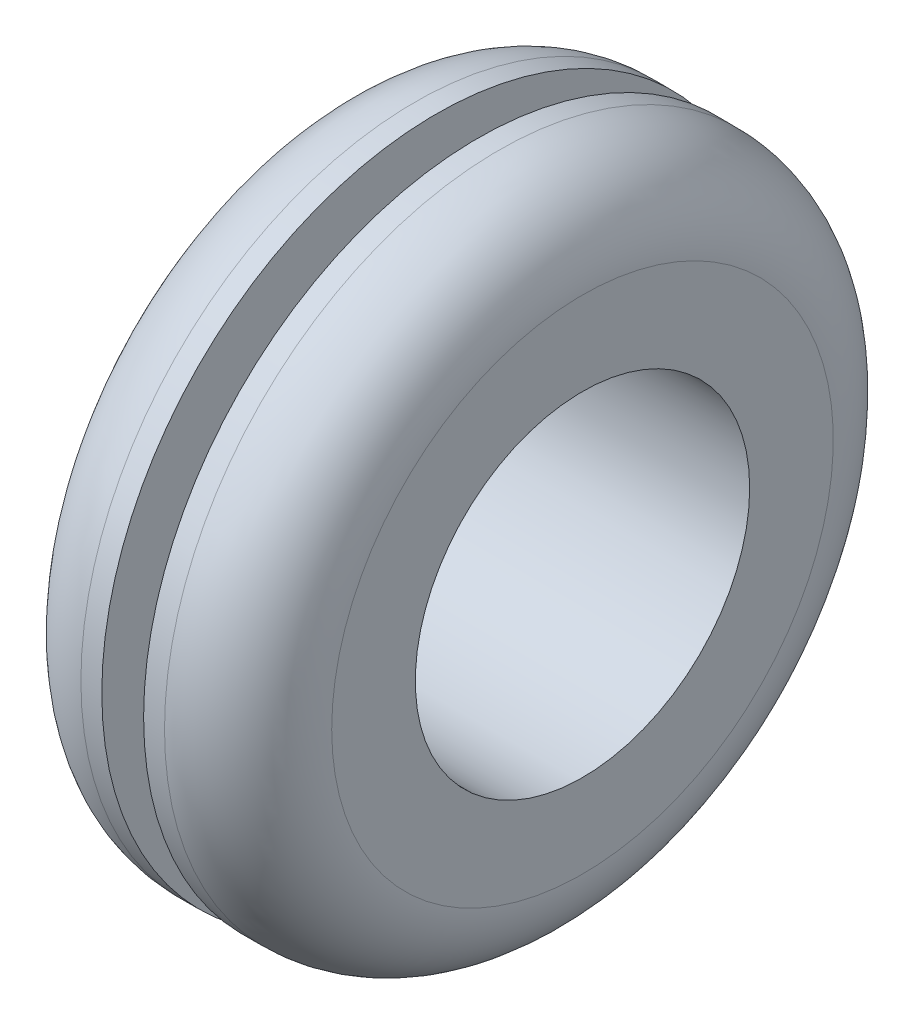
ISO-10303-21;
HEADER;
FILE_DESCRIPTION(('STEP AP214'),'2;1');
FILE_NAME('part.step','',(''),(''),'','','');
FILE_SCHEMA(('AUTOMOTIVE_DESIGN { 1 0 10303 214 1 1 1 1 }'));
ENDSEC;
DATA;
#1=APPLICATION_CONTEXT('core data for automotive mechanical design processes');
#2=APPLICATION_PROTOCOL_DEFINITION('international standard','automotive_design',2000,#1);
#3=PRODUCT_CONTEXT('',#1,'mechanical');
#4=PRODUCT('Part','Part','',(#3));
#5=PRODUCT_RELATED_PRODUCT_CATEGORY('part','',(#4));
#6=PRODUCT_DEFINITION_FORMATION('','',#4);
#7=PRODUCT_DEFINITION_CONTEXT('part definition',#1,'design');
#8=PRODUCT_DEFINITION('design','',#6,#7);
#9=PRODUCT_DEFINITION_SHAPE('','',#8);
#10=(LENGTH_UNIT() NAMED_UNIT(*) SI_UNIT(.MILLI.,.METRE.));
#11=(NAMED_UNIT(*) PLANE_ANGLE_UNIT() SI_UNIT($,.RADIAN.));
#12=(NAMED_UNIT(*) SI_UNIT($,.STERADIAN.) SOLID_ANGLE_UNIT());
#13=UNCERTAINTY_MEASURE_WITH_UNIT(LENGTH_MEASURE(1.E-05),#10,'distance_accuracy_value','');
#14=(GEOMETRIC_REPRESENTATION_CONTEXT(3) GLOBAL_UNCERTAINTY_ASSIGNED_CONTEXT((#13)) GLOBAL_UNIT_ASSIGNED_CONTEXT((#10,
#11,#12)) REPRESENTATION_CONTEXT('',''));
#15=CARTESIAN_POINT('',(0.,0.,0.));
#16=DIRECTION('',(0.,0.,1.));
#17=DIRECTION('',(1.,0.,0.));
#18=AXIS2_PLACEMENT_3D('',#15,#16,#17);
#19=CARTESIAN_POINT('',(-31.1145283319512,0.,0.));
#20=DIRECTION('',(-1.,0.,0.));
#21=DIRECTION('',(0.,0.,1.));
#22=AXIS2_PLACEMENT_3D('',#19,#20,#21);
#23=CYLINDRICAL_SURFACE('',#22,8.);
#24=CARTESIAN_POINT('',(-24.283026584867,0.,0.));
#25=DIRECTION('',(1.,0.,0.));
#26=DIRECTION('',(0.,0.,-1.));
#27=AXIS2_PLACEMENT_3D('',#24,#25,#26);
#28=CIRCLE('',#27,8.);
#29=CARTESIAN_POINT('',(-24.283026584867,0.,-8.));
#30=VERTEX_POINT('',#29);
#31=EDGE_CURVE('E40',#30,#30,#28,.T.);
#32=ORIENTED_EDGE('',*,*,#31,.T.);
#33=EDGE_LOOP('',(#32));
#34=FACE_BOUND('',#33,.T.);
#35=CARTESIAN_POINT('',(-23.783026584867,0.,0.));
#36=DIRECTION('',(-1.,0.,0.));
#37=DIRECTION('',(0.,0.,1.));
#38=AXIS2_PLACEMENT_3D('',#35,#36,#37);
#39=CIRCLE('',#38,8.);
#40=CARTESIAN_POINT('',(-23.783026584867,0.,8.));
#41=VERTEX_POINT('',#40);
#42=EDGE_CURVE('E49',#41,#41,#39,.T.);
#43=ORIENTED_EDGE('',*,*,#42,.T.);
#44=EDGE_LOOP('',(#43));
#45=FACE_BOUND('',#44,.T.);
#46=ADVANCED_FACE('F29',(#34,#45),#23,.T.);
#47=CARTESIAN_POINT('',(-23.783026584867,8.,0.));
#48=DIRECTION('',(-1.,0.,0.));
#49=DIRECTION('',(0.,0.,1.));
#50=AXIS2_PLACEMENT_3D('',#47,#48,#49);
#51=PLANE('',#50);
#52=ORIENTED_EDGE('',*,*,#42,.F.);
#53=EDGE_LOOP('',(#52));
#54=FACE_BOUND('',#53,.T.);
#55=CARTESIAN_POINT('',(-23.783026584867,0.,0.));
#56=DIRECTION('',(-1.,0.,0.));
#57=DIRECTION('',(0.,0.,1.));
#58=AXIS2_PLACEMENT_3D('',#55,#56,#57);
#59=CIRCLE('',#58,6.);
#60=CARTESIAN_POINT('',(-23.783026584867,0.,6.));
#61=VERTEX_POINT('',#60);
#62=EDGE_CURVE('E57',#61,#61,#59,.T.);
#63=ORIENTED_EDGE('',*,*,#62,.T.);
#64=EDGE_LOOP('',(#63));
#65=FACE_BOUND('',#64,.T.);
#66=ADVANCED_FACE('F85',(#54,#65),#51,.F.);
#67=CARTESIAN_POINT('',(-31.1145283319512,0.,0.));
#68=DIRECTION('',(-1.,0.,0.));
#69=DIRECTION('',(0.,0.,1.));
#70=AXIS2_PLACEMENT_3D('',#67,#68,#69);
#71=CYLINDRICAL_SURFACE('',#70,6.);
#72=ORIENTED_EDGE('',*,*,#62,.F.);
#73=EDGE_LOOP('',(#72));
#74=FACE_BOUND('',#73,.T.);
#75=CARTESIAN_POINT('',(-22.783026584867,0.,0.));
#76=DIRECTION('',(-1.,0.,0.));
#77=DIRECTION('',(0.,0.,1.));
#78=AXIS2_PLACEMENT_3D('',#75,#76,#77);
#79=CIRCLE('',#78,6.);
#80=CARTESIAN_POINT('',(-22.783026584867,0.,6.));
#81=VERTEX_POINT('',#80);
#82=EDGE_CURVE('E60',#81,#81,#79,.T.);
#83=ORIENTED_EDGE('',*,*,#82,.T.);
#84=EDGE_LOOP('',(#83));
#85=FACE_BOUND('',#84,.T.);
#86=ADVANCED_FACE('F91',(#74,#85),#71,.T.);
#87=CARTESIAN_POINT('',(-22.783026584867,8.,0.));
#88=DIRECTION('',(1.,0.,0.));
#89=DIRECTION('',(0.,0.,-1.));
#90=AXIS2_PLACEMENT_3D('',#87,#88,#89);
#91=PLANE('',#90);
#92=ORIENTED_EDGE('',*,*,#82,.F.);
#93=EDGE_LOOP('',(#92));
#94=FACE_BOUND('',#93,.T.);
#95=CARTESIAN_POINT('',(-22.783026584867,0.,0.));
#96=DIRECTION('',(-1.,0.,0.));
#97=DIRECTION('',(0.,0.,1.));
#98=AXIS2_PLACEMENT_3D('',#95,#96,#97);
#99=CIRCLE('',#98,8.);
#100=CARTESIAN_POINT('',(-22.783026584867,0.,8.));
#101=VERTEX_POINT('',#100);
#102=EDGE_CURVE('E53',#101,#101,#99,.T.);
#103=ORIENTED_EDGE('',*,*,#102,.T.);
#104=EDGE_LOOP('',(#103));
#105=FACE_BOUND('',#104,.T.);
#106=ADVANCED_FACE('F82',(#94,#105),#91,.F.);
#107=CARTESIAN_POINT('',(-31.1145283319512,0.,0.));
#108=DIRECTION('',(-1.,0.,0.));
#109=DIRECTION('',(0.,0.,1.));
#110=AXIS2_PLACEMENT_3D('',#107,#108,#109);
#111=CYLINDRICAL_SURFACE('',#110,8.);
#112=CARTESIAN_POINT('',(-22.283026584867,0.,0.));
#113=DIRECTION('',(-1.,0.,0.));
#114=DIRECTION('',(0.,0.,1.));
#115=AXIS2_PLACEMENT_3D('',#112,#113,#114);
#116=CIRCLE('',#115,8.);
#117=CARTESIAN_POINT('',(-22.283026584867,0.,8.));
#118=VERTEX_POINT('',#117);
#119=EDGE_CURVE('E36',#118,#118,#116,.T.);
#120=ORIENTED_EDGE('',*,*,#119,.T.);
#121=EDGE_LOOP('',(#120));
#122=FACE_BOUND('',#121,.T.);
#123=ORIENTED_EDGE('',*,*,#102,.F.);
#124=EDGE_LOOP('',(#123));
#125=FACE_BOUND('',#124,.T.);
#126=ADVANCED_FACE('F74',(#122,#125),#111,.T.);
#127=CARTESIAN_POINT('',(-20.283026584867,8.,0.));
#128=DIRECTION('',(-1.,0.,0.));
#129=DIRECTION('',(0.,0.,1.));
#130=AXIS2_PLACEMENT_3D('',#127,#128,#129);
#131=PLANE('',#130);
#132=CARTESIAN_POINT('',(-20.283026584867,0.,0.));
#133=DIRECTION('',(-1.,0.,0.));
#134=DIRECTION('',(0.,0.,1.));
#135=AXIS2_PLACEMENT_3D('',#132,#133,#134);
#136=CIRCLE('',#135,6.);
#137=CARTESIAN_POINT('',(-20.283026584867,0.,6.));
#138=VERTEX_POINT('',#137);
#139=EDGE_CURVE('E10',#138,#138,#136,.F.);
#140=ORIENTED_EDGE('',*,*,#139,.T.);
#141=EDGE_LOOP('',(#140));
#142=FACE_BOUND('',#141,.T.);
#143=CARTESIAN_POINT('',(-20.283026584867,0.,0.));
#144=DIRECTION('',(1.,0.,0.));
#145=DIRECTION('',(0.,0.,-1.));
#146=AXIS2_PLACEMENT_3D('',#143,#144,#145);
#147=CIRCLE('',#146,4.);
#148=CARTESIAN_POINT('',(-20.283026584867,0.,-4.));
#149=VERTEX_POINT('',#148);
#150=EDGE_CURVE('E54',#149,#149,#147,.T.);
#151=ORIENTED_EDGE('',*,*,#150,.F.);
#152=EDGE_LOOP('',(#151));
#153=FACE_BOUND('',#152,.T.);
#154=ADVANCED_FACE('F71',(#142,#153),#131,.F.);
#155=CARTESIAN_POINT('',(-26.283026584867,8.,0.));
#156=DIRECTION('',(1.,0.,0.));
#157=DIRECTION('',(0.,0.,-1.));
#158=AXIS2_PLACEMENT_3D('',#155,#156,#157);
#159=PLANE('',#158);
#160=CARTESIAN_POINT('',(-26.283026584867,0.,0.));
#161=DIRECTION('',(1.,0.,0.));
#162=DIRECTION('',(0.,0.,-1.));
#163=AXIS2_PLACEMENT_3D('',#160,#161,#162);
#164=CIRCLE('',#163,6.);
#165=CARTESIAN_POINT('',(-26.283026584867,0.,-6.));
#166=VERTEX_POINT('',#165);
#167=EDGE_CURVE('E44',#166,#166,#164,.F.);
#168=ORIENTED_EDGE('',*,*,#167,.T.);
#169=EDGE_LOOP('',(#168));
#170=FACE_BOUND('',#169,.T.);
#171=CARTESIAN_POINT('',(-26.283026584867,0.,0.));
#172=DIRECTION('',(1.,0.,0.));
#173=DIRECTION('',(0.,0.,-1.));
#174=AXIS2_PLACEMENT_3D('',#171,#172,#173);
#175=CIRCLE('',#174,4.);
#176=CARTESIAN_POINT('',(-26.283026584867,0.,-4.));
#177=VERTEX_POINT('',#176);
#178=EDGE_CURVE('E50',#177,#177,#175,.T.);
#179=ORIENTED_EDGE('',*,*,#178,.T.);
#180=EDGE_LOOP('',(#179));
#181=FACE_BOUND('',#180,.T.);
#182=ADVANCED_FACE('F73',(#170,#181),#159,.F.);
#183=CARTESIAN_POINT('',(-30.283026584867,0.,0.));
#184=DIRECTION('',(1.,0.,0.));
#185=DIRECTION('',(0.,0.,-1.));
#186=AXIS2_PLACEMENT_3D('',#183,#184,#185);
#187=CYLINDRICAL_SURFACE('',#186,4.);
#188=ORIENTED_EDGE('',*,*,#150,.T.);
#189=EDGE_LOOP('',(#188));
#190=FACE_BOUND('',#189,.T.);
#191=ORIENTED_EDGE('',*,*,#178,.F.);
#192=EDGE_LOOP('',(#191));
#193=FACE_BOUND('',#192,.T.);
#194=ADVANCED_FACE('F68',(#190,#193),#187,.F.);
#195=CARTESIAN_POINT('',(-24.283026584867,0.,0.));
#196=DIRECTION('',(1.,0.,0.));
#197=DIRECTION('',(0.,0.,-1.));
#198=AXIS2_PLACEMENT_3D('',#195,#196,#197);
#199=TOROIDAL_SURFACE('',#198,6.,2.);
#200=ORIENTED_EDGE('',*,*,#31,.F.);
#201=EDGE_LOOP('',(#200));
#202=FACE_BOUND('',#201,.T.);
#203=ORIENTED_EDGE('',*,*,#167,.F.);
#204=EDGE_LOOP('',(#203));
#205=FACE_BOUND('',#204,.T.);
#206=ADVANCED_FACE('F96',(#202,#205),#199,.T.);
#207=CARTESIAN_POINT('',(-22.283026584867,0.,0.));
#208=DIRECTION('',(-1.,0.,0.));
#209=DIRECTION('',(0.,0.,1.));
#210=AXIS2_PLACEMENT_3D('',#207,#208,#209);
#211=TOROIDAL_SURFACE('',#210,6.,2.);
#212=ORIENTED_EDGE('',*,*,#139,.F.);
#213=EDGE_LOOP('',(#212));
#214=FACE_BOUND('',#213,.T.);
#215=ORIENTED_EDGE('',*,*,#119,.F.);
#216=EDGE_LOOP('',(#215));
#217=FACE_BOUND('',#216,.T.);
#218=ADVANCED_FACE('F31',(#214,#217),#211,.T.);
#219=CLOSED_SHELL('',(#46,#66,#86,#106,#126,#154,#182,#194,#206,#218));
#220=MANIFOLD_SOLID_BREP('B2',#219);
#221=ADVANCED_BREP_SHAPE_REPRESENTATION('',(#18,#220),#14);
#222=SHAPE_DEFINITION_REPRESENTATION(#9,#221);
ENDSEC;
END-ISO-10303-21;
